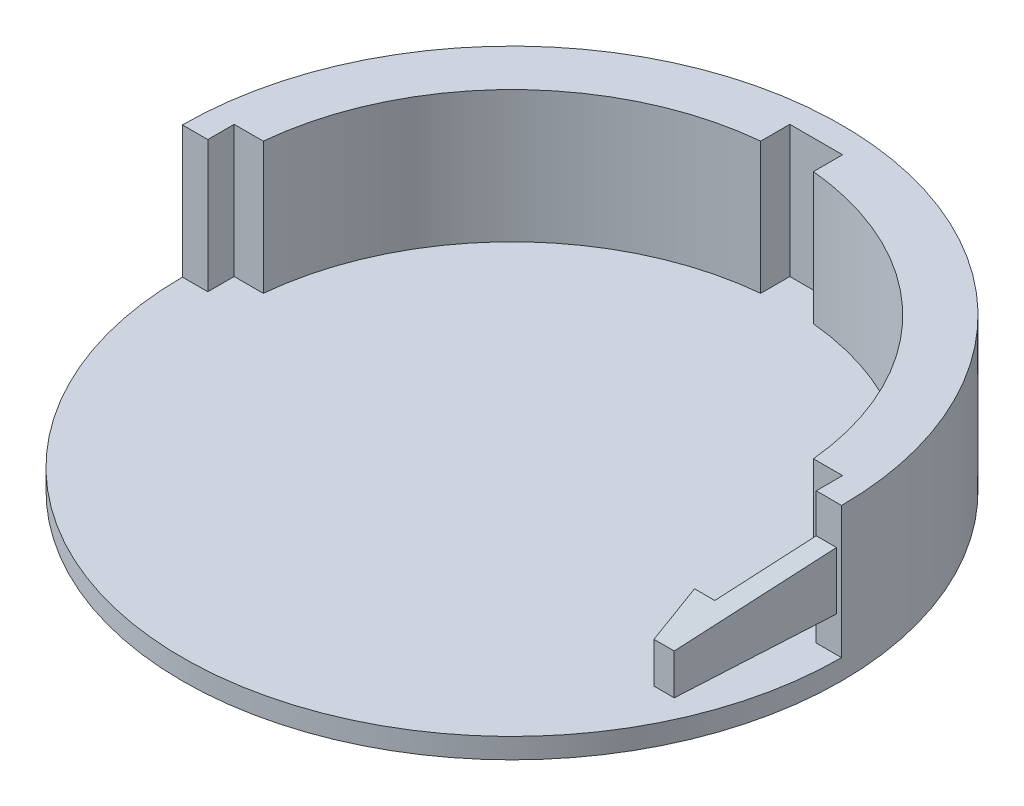
ISO-10303-21;
HEADER;
FILE_DESCRIPTION(('STEP AP214'),'2;1');
FILE_NAME('part.step','',(''),(''),'','','');
FILE_SCHEMA(('AUTOMOTIVE_DESIGN { 1 0 10303 214 1 1 1 1 }'));
ENDSEC;
DATA;
#1=APPLICATION_CONTEXT('core data for automotive mechanical design processes');
#2=APPLICATION_PROTOCOL_DEFINITION('international standard','automotive_design',2000,#1);
#3=PRODUCT_CONTEXT('',#1,'mechanical');
#4=PRODUCT('Part','Part','',(#3));
#5=PRODUCT_RELATED_PRODUCT_CATEGORY('part','',(#4));
#6=PRODUCT_DEFINITION_FORMATION('','',#4);
#7=PRODUCT_DEFINITION_CONTEXT('part definition',#1,'design');
#8=PRODUCT_DEFINITION('design','',#6,#7);
#9=PRODUCT_DEFINITION_SHAPE('','',#8);
#10=(LENGTH_UNIT() NAMED_UNIT(*) SI_UNIT(.MILLI.,.METRE.));
#11=(NAMED_UNIT(*) PLANE_ANGLE_UNIT() SI_UNIT($,.RADIAN.));
#12=(NAMED_UNIT(*) SI_UNIT($,.STERADIAN.) SOLID_ANGLE_UNIT());
#13=UNCERTAINTY_MEASURE_WITH_UNIT(LENGTH_MEASURE(1.E-05),#10,'distance_accuracy_value','');
#14=(GEOMETRIC_REPRESENTATION_CONTEXT(3) GLOBAL_UNCERTAINTY_ASSIGNED_CONTEXT((#13)) GLOBAL_UNIT_ASSIGNED_CONTEXT((#10,
#11,#12)) REPRESENTATION_CONTEXT('',''));
#15=CARTESIAN_POINT('',(0.,0.,0.));
#16=DIRECTION('',(0.,0.,1.));
#17=DIRECTION('',(1.,0.,0.));
#18=AXIS2_PLACEMENT_3D('',#15,#16,#17);
#19=CARTESIAN_POINT('',(0.,2.,0.));
#20=DIRECTION('',(0.,-1.,0.));
#21=DIRECTION('',(0.,0.,-1.));
#22=AXIS2_PLACEMENT_3D('',#19,#20,#21);
#23=CYLINDRICAL_SURFACE('',#22,32.5);
#24=CARTESIAN_POINT('',(0.,15.,0.));
#25=DIRECTION('',(0.,1.,0.));
#26=DIRECTION('',(0.,0.,1.));
#27=AXIS2_PLACEMENT_3D('',#24,#25,#26);
#28=CIRCLE('',#27,32.5);
#29=CARTESIAN_POINT('',(32.5,15.,0.));
#30=VERTEX_POINT('',#29);
#31=CARTESIAN_POINT('',(-32.5,15.,0.));
#32=VERTEX_POINT('',#31);
#33=EDGE_CURVE('E245',#30,#32,#28,.T.);
#34=ORIENTED_EDGE('',*,*,#33,.F.);
#35=DIRECTION('',(0.,-1.,0.));
#36=VECTOR('',#35,1.);
#37=CARTESIAN_POINT('',(32.5,2.,0.));
#38=LINE('',#37,#36);
#39=CARTESIAN_POINT('',(32.5,2.,0.));
#40=VERTEX_POINT('',#39);
#41=EDGE_CURVE('E208',#30,#40,#38,.T.);
#42=ORIENTED_EDGE('',*,*,#41,.T.);
#43=CARTESIAN_POINT('',(0.,2.,0.));
#44=DIRECTION('',(0.,1.,0.));
#45=DIRECTION('',(0.,0.,1.));
#46=AXIS2_PLACEMENT_3D('',#43,#44,#45);
#47=CIRCLE('',#46,32.5);
#48=CARTESIAN_POINT('',(-32.5,2.,0.));
#49=VERTEX_POINT('',#48);
#50=EDGE_CURVE('E212',#49,#40,#47,.T.);
#51=ORIENTED_EDGE('',*,*,#50,.F.);
#52=DIRECTION('',(0.,-1.,0.));
#53=VECTOR('',#52,1.);
#54=CARTESIAN_POINT('',(-32.5,2.,0.));
#55=LINE('',#54,#53);
#56=EDGE_CURVE('E198',#49,#32,#55,.F.);
#57=ORIENTED_EDGE('',*,*,#56,.T.);
#58=EDGE_LOOP('',(#34,#42,#51,#57));
#59=FACE_BOUND('',#58,.T.);
#60=CARTESIAN_POINT('',(0.,0.,0.));
#61=DIRECTION('',(0.,1.,0.));
#62=DIRECTION('',(0.,0.,1.));
#63=AXIS2_PLACEMENT_3D('',#60,#61,#62);
#64=CIRCLE('',#63,32.5);
#65=CARTESIAN_POINT('',(0.,0.,32.5));
#66=VERTEX_POINT('',#65);
#67=EDGE_CURVE('E11',#66,#66,#64,.T.);
#68=ORIENTED_EDGE('',*,*,#67,.T.);
#69=EDGE_LOOP('',(#68));
#70=FACE_BOUND('',#69,.T.);
#71=ADVANCED_FACE('F41',(#59,#70),#23,.T.);
#72=CARTESIAN_POINT('',(0.,0.,0.));
#73=DIRECTION('',(0.,1.,0.));
#74=DIRECTION('',(0.,0.,1.));
#75=AXIS2_PLACEMENT_3D('',#72,#73,#74);
#76=PLANE('',#75);
#77=ORIENTED_EDGE('',*,*,#67,.F.);
#78=EDGE_LOOP('',(#77));
#79=FACE_BOUND('',#78,.T.);
#80=ADVANCED_FACE('F428',(#79),#76,.F.);
#81=CARTESIAN_POINT('',(-30.,15.,0.));
#82=DIRECTION('',(-1.,0.,0.));
#83=DIRECTION('',(0.,0.,1.));
#84=AXIS2_PLACEMENT_3D('',#81,#82,#83);
#85=PLANE('',#84);
#86=DIRECTION('',(0.,0.,-1.));
#87=VECTOR('',#86,1.);
#88=CARTESIAN_POINT('',(-30.,15.,0.));
#89=LINE('',#88,#87);
#90=CARTESIAN_POINT('',(-30.,15.,0.));
#91=VERTEX_POINT('',#90);
#92=CARTESIAN_POINT('',(-30.,15.,-2.60000000000002));
#93=VERTEX_POINT('',#92);
#94=EDGE_CURVE('E223',#91,#93,#89,.T.);
#95=ORIENTED_EDGE('',*,*,#94,.F.);
#96=DIRECTION('',(0.,-1.,0.));
#97=VECTOR('',#96,1.);
#98=CARTESIAN_POINT('',(-30.,15.,0.));
#99=LINE('',#98,#97);
#100=CARTESIAN_POINT('',(-30.,2.,0.));
#101=VERTEX_POINT('',#100);
#102=EDGE_CURVE('E64',#91,#101,#99,.T.);
#103=ORIENTED_EDGE('',*,*,#102,.T.);
#104=DIRECTION('',(0.,0.,-1.));
#105=VECTOR('',#104,1.);
#106=CARTESIAN_POINT('',(-30.,2.,0.));
#107=LINE('',#106,#105);
#108=CARTESIAN_POINT('',(-30.,2.,-2.60000000000002));
#109=VERTEX_POINT('',#108);
#110=EDGE_CURVE('E215',#101,#109,#107,.T.);
#111=ORIENTED_EDGE('',*,*,#110,.T.);
#112=DIRECTION('',(0.,-1.,0.));
#113=VECTOR('',#112,1.);
#114=CARTESIAN_POINT('',(-30.,15.,-2.60000000000002));
#115=LINE('',#114,#113);
#116=EDGE_CURVE('E49',#93,#109,#115,.T.);
#117=ORIENTED_EDGE('',*,*,#116,.F.);
#118=EDGE_LOOP('',(#95,#103,#111,#117));
#119=FACE_BOUND('',#118,.T.);
#120=ADVANCED_FACE('F435',(#119),#85,.F.);
#121=CARTESIAN_POINT('',(0.,15.,-2.60000000000002));
#122=DIRECTION('',(0.,0.,-1.));
#123=DIRECTION('',(-1.,0.,0.));
#124=AXIS2_PLACEMENT_3D('',#121,#122,#123);
#125=PLANE('',#124);
#126=DIRECTION('',(1.,0.,0.));
#127=VECTOR('',#126,1.);
#128=CARTESIAN_POINT('',(0.,2.,-2.60000000000002));
#129=LINE('',#128,#127);
#130=CARTESIAN_POINT('',(-27.1256797149859,2.,-2.60000000000002));
#131=VERTEX_POINT('',#130);
#132=EDGE_CURVE('E259',#109,#131,#129,.T.);
#133=ORIENTED_EDGE('',*,*,#132,.T.);
#134=DIRECTION('',(0.,-1.,0.));
#135=VECTOR('',#134,1.);
#136=CARTESIAN_POINT('',(-27.1256797149859,15.,-2.60000000000002));
#137=LINE('',#136,#135);
#138=CARTESIAN_POINT('',(-27.1256797149859,15.,-2.60000000000002));
#139=VERTEX_POINT('',#138);
#140=EDGE_CURVE('E296',#139,#131,#137,.T.);
#141=ORIENTED_EDGE('',*,*,#140,.F.);
#142=DIRECTION('',(1.,0.,0.));
#143=VECTOR('',#142,1.);
#144=CARTESIAN_POINT('',(0.,15.,-2.60000000000002));
#145=LINE('',#144,#143);
#146=EDGE_CURVE('E226',#93,#139,#145,.T.);
#147=ORIENTED_EDGE('',*,*,#146,.F.);
#148=ORIENTED_EDGE('',*,*,#116,.T.);
#149=EDGE_LOOP('',(#133,#141,#147,#148));
#150=FACE_BOUND('',#149,.T.);
#151=ADVANCED_FACE('F304',(#150),#125,.F.);
#152=CARTESIAN_POINT('',(0.,15.,0.));
#153=DIRECTION('',(0.,-1.,0.));
#154=DIRECTION('',(0.,0.,-1.));
#155=AXIS2_PLACEMENT_3D('',#152,#153,#154);
#156=CYLINDRICAL_SURFACE('',#155,27.25);
#157=CARTESIAN_POINT('',(0.,2.,0.));
#158=DIRECTION('',(0.,1.,0.));
#159=DIRECTION('',(0.,0.,1.));
#160=AXIS2_PLACEMENT_3D('',#157,#158,#159);
#161=CIRCLE('',#160,27.25);
#162=CARTESIAN_POINT('',(-2.59999999999999,2.,-27.1256797149859));
#163=VERTEX_POINT('',#162);
#164=EDGE_CURVE('E256',#163,#131,#161,.T.);
#165=ORIENTED_EDGE('',*,*,#164,.F.);
#166=DIRECTION('',(0.,-1.,0.));
#167=VECTOR('',#166,1.);
#168=CARTESIAN_POINT('',(-2.59999999999999,15.,-27.1256797149859));
#169=LINE('',#168,#167);
#170=CARTESIAN_POINT('',(-2.59999999999999,15.,-27.1256797149859));
#171=VERTEX_POINT('',#170);
#172=EDGE_CURVE('E293',#171,#163,#169,.T.);
#173=ORIENTED_EDGE('',*,*,#172,.F.);
#174=CARTESIAN_POINT('',(0.,15.,0.));
#175=DIRECTION('',(0.,1.,0.));
#176=DIRECTION('',(0.,0.,1.));
#177=AXIS2_PLACEMENT_3D('',#174,#175,#176);
#178=CIRCLE('',#177,27.25);
#179=EDGE_CURVE('E222',#171,#139,#178,.T.);
#180=ORIENTED_EDGE('',*,*,#179,.T.);
#181=ORIENTED_EDGE('',*,*,#140,.T.);
#182=EDGE_LOOP('',(#165,#173,#180,#181));
#183=FACE_BOUND('',#182,.T.);
#184=ADVANCED_FACE('F321',(#183),#156,.F.);
#185=CARTESIAN_POINT('',(-2.59999999999999,15.,0.));
#186=DIRECTION('',(1.,0.,0.));
#187=DIRECTION('',(0.,0.,-1.));
#188=AXIS2_PLACEMENT_3D('',#185,#186,#187);
#189=PLANE('',#188);
#190=DIRECTION('',(0.,0.,1.));
#191=VECTOR('',#190,1.);
#192=CARTESIAN_POINT('',(-2.59999999999999,2.,0.));
#193=LINE('',#192,#191);
#194=CARTESIAN_POINT('',(-2.59999999999999,2.,-30.));
#195=VERTEX_POINT('',#194);
#196=EDGE_CURVE('E263',#195,#163,#193,.T.);
#197=ORIENTED_EDGE('',*,*,#196,.F.);
#198=DIRECTION('',(0.,-1.,0.));
#199=VECTOR('',#198,1.);
#200=CARTESIAN_POINT('',(-2.59999999999999,15.,-30.));
#201=LINE('',#200,#199);
#202=CARTESIAN_POINT('',(-2.59999999999999,15.,-30.));
#203=VERTEX_POINT('',#202);
#204=EDGE_CURVE('E290',#203,#195,#201,.T.);
#205=ORIENTED_EDGE('',*,*,#204,.F.);
#206=DIRECTION('',(0.,0.,1.));
#207=VECTOR('',#206,1.);
#208=CARTESIAN_POINT('',(-2.59999999999999,15.,0.));
#209=LINE('',#208,#207);
#210=EDGE_CURVE('E229',#203,#171,#209,.T.);
#211=ORIENTED_EDGE('',*,*,#210,.T.);
#212=ORIENTED_EDGE('',*,*,#172,.T.);
#213=EDGE_LOOP('',(#197,#205,#211,#212));
#214=FACE_BOUND('',#213,.T.);
#215=ADVANCED_FACE('F327',(#214),#189,.T.);
#216=CARTESIAN_POINT('',(0.,15.,-30.));
#217=DIRECTION('',(0.,0.,-1.));
#218=DIRECTION('',(-1.,0.,0.));
#219=AXIS2_PLACEMENT_3D('',#216,#217,#218);
#220=PLANE('',#219);
#221=DIRECTION('',(1.,0.,0.));
#222=VECTOR('',#221,1.);
#223=CARTESIAN_POINT('',(0.,2.,-30.));
#224=LINE('',#223,#222);
#225=CARTESIAN_POINT('',(2.60000000000001,2.,-30.));
#226=VERTEX_POINT('',#225);
#227=EDGE_CURVE('E267',#195,#226,#224,.T.);
#228=ORIENTED_EDGE('',*,*,#227,.T.);
#229=DIRECTION('',(0.,-1.,0.));
#230=VECTOR('',#229,1.);
#231=CARTESIAN_POINT('',(2.60000000000001,15.,-30.));
#232=LINE('',#231,#230);
#233=CARTESIAN_POINT('',(2.60000000000001,15.,-30.));
#234=VERTEX_POINT('',#233);
#235=EDGE_CURVE('E286',#234,#226,#232,.T.);
#236=ORIENTED_EDGE('',*,*,#235,.F.);
#237=DIRECTION('',(1.,0.,0.));
#238=VECTOR('',#237,1.);
#239=CARTESIAN_POINT('',(0.,15.,-30.));
#240=LINE('',#239,#238);
#241=EDGE_CURVE('E233',#203,#234,#240,.T.);
#242=ORIENTED_EDGE('',*,*,#241,.F.);
#243=ORIENTED_EDGE('',*,*,#204,.T.);
#244=EDGE_LOOP('',(#228,#236,#242,#243));
#245=FACE_BOUND('',#244,.T.);
#246=ADVANCED_FACE('F331',(#245),#220,.F.);
#247=CARTESIAN_POINT('',(2.60000000000001,15.,0.));
#248=DIRECTION('',(1.,0.,0.));
#249=DIRECTION('',(0.,0.,-1.));
#250=AXIS2_PLACEMENT_3D('',#247,#248,#249);
#251=PLANE('',#250);
#252=DIRECTION('',(0.,0.,1.));
#253=VECTOR('',#252,1.);
#254=CARTESIAN_POINT('',(2.60000000000001,2.,0.));
#255=LINE('',#254,#253);
#256=CARTESIAN_POINT('',(2.60000000000001,2.,-27.1256797149859));
#257=VERTEX_POINT('',#256);
#258=EDGE_CURVE('E255',#226,#257,#255,.T.);
#259=ORIENTED_EDGE('',*,*,#258,.T.);
#260=DIRECTION('',(0.,-1.,0.));
#261=VECTOR('',#260,1.);
#262=CARTESIAN_POINT('',(2.60000000000001,15.,-27.1256797149859));
#263=LINE('',#262,#261);
#264=CARTESIAN_POINT('',(2.60000000000001,15.,-27.1256797149859));
#265=VERTEX_POINT('',#264);
#266=EDGE_CURVE('E283',#265,#257,#263,.T.);
#267=ORIENTED_EDGE('',*,*,#266,.F.);
#268=DIRECTION('',(0.,0.,1.));
#269=VECTOR('',#268,1.);
#270=CARTESIAN_POINT('',(2.60000000000001,15.,0.));
#271=LINE('',#270,#269);
#272=EDGE_CURVE('E221',#234,#265,#271,.T.);
#273=ORIENTED_EDGE('',*,*,#272,.F.);
#274=ORIENTED_EDGE('',*,*,#235,.T.);
#275=EDGE_LOOP('',(#259,#267,#273,#274));
#276=FACE_BOUND('',#275,.T.);
#277=ADVANCED_FACE('F337',(#276),#251,.F.);
#278=CARTESIAN_POINT('',(27.1256797149859,2.,-2.60000000000001));
#279=VERTEX_POINT('',#278);
#280=EDGE_CURVE('E250',#279,#257,#161,.T.);
#281=ORIENTED_EDGE('',*,*,#280,.F.);
#282=DIRECTION('',(0.,-1.,0.));
#283=VECTOR('',#282,1.);
#284=CARTESIAN_POINT('',(27.1256797149859,15.,-2.60000000000001));
#285=LINE('',#284,#283);
#286=CARTESIAN_POINT('',(27.1256797149859,15.,-2.60000000000001));
#287=VERTEX_POINT('',#286);
#288=EDGE_CURVE('E280',#287,#279,#285,.T.);
#289=ORIENTED_EDGE('',*,*,#288,.F.);
#290=EDGE_CURVE('E216',#287,#265,#178,.T.);
#291=ORIENTED_EDGE('',*,*,#290,.T.);
#292=ORIENTED_EDGE('',*,*,#266,.T.);
#293=EDGE_LOOP('',(#281,#289,#291,#292));
#294=FACE_BOUND('',#293,.T.);
#295=ADVANCED_FACE('F341',(#294),#156,.F.);
#296=CARTESIAN_POINT('',(0.,15.,-2.6));
#297=DIRECTION('',(0.,0.,1.));
#298=DIRECTION('',(1.,0.,0.));
#299=AXIS2_PLACEMENT_3D('',#296,#297,#298);
#300=PLANE('',#299);
#301=DIRECTION('',(-1.,0.,0.));
#302=VECTOR('',#301,1.);
#303=CARTESIAN_POINT('',(0.,2.,-2.6));
#304=LINE('',#303,#302);
#305=CARTESIAN_POINT('',(30.,2.,-2.60000000000001));
#306=VERTEX_POINT('',#305);
#307=EDGE_CURVE('E254',#306,#279,#304,.T.);
#308=ORIENTED_EDGE('',*,*,#307,.F.);
#309=DIRECTION('',(0.,-1.,0.));
#310=VECTOR('',#309,1.);
#311=CARTESIAN_POINT('',(30.,15.,-2.60000000000001));
#312=LINE('',#311,#310);
#313=CARTESIAN_POINT('',(30.,15.,-2.60000000000001));
#314=VERTEX_POINT('',#313);
#315=EDGE_CURVE('E249',#314,#306,#312,.T.);
#316=ORIENTED_EDGE('',*,*,#315,.F.);
#317=DIRECTION('',(-1.,0.,0.));
#318=VECTOR('',#317,1.);
#319=CARTESIAN_POINT('',(0.,15.,-2.6));
#320=LINE('',#319,#318);
#321=EDGE_CURVE('E220',#314,#287,#320,.T.);
#322=ORIENTED_EDGE('',*,*,#321,.T.);
#323=ORIENTED_EDGE('',*,*,#288,.T.);
#324=EDGE_LOOP('',(#308,#316,#322,#323));
#325=FACE_BOUND('',#324,.T.);
#326=ADVANCED_FACE('F344',(#325),#300,.T.);
#327=CARTESIAN_POINT('',(30.,15.,0.));
#328=DIRECTION('',(1.,0.,0.));
#329=DIRECTION('',(0.,0.,-1.));
#330=AXIS2_PLACEMENT_3D('',#327,#328,#329);
#331=PLANE('',#330);
#332=DIRECTION('',(0.,0.,1.));
#333=VECTOR('',#332,1.);
#334=CARTESIAN_POINT('',(30.,2.,0.));
#335=LINE('',#334,#333);
#336=CARTESIAN_POINT('',(30.,2.,0.));
#337=VERTEX_POINT('',#336);
#338=EDGE_CURVE('E192',#306,#337,#335,.T.);
#339=ORIENTED_EDGE('',*,*,#338,.T.);
#340=DIRECTION('',(0.,1.,0.));
#341=VECTOR('',#340,1.);
#342=CARTESIAN_POINT('',(30.,15.,0.));
#343=LINE('',#342,#341);
#344=CARTESIAN_POINT('',(30.,5.47852393282351,0.));
#345=VERTEX_POINT('',#344);
#346=EDGE_CURVE('E182',#337,#345,#343,.T.);
#347=ORIENTED_EDGE('',*,*,#346,.T.);
#348=DIRECTION('',(0.,-0.0523359562429438,-0.998629534754574));
#349=VECTOR('',#348,1.);
#350=CARTESIAN_POINT('',(30.,6.31704840135217,16.));
#351=LINE('',#350,#349);
#352=CARTESIAN_POINT('',(30.,6.00260172565392,10.));
#353=VERTEX_POINT('',#352);
#354=EDGE_CURVE('E166',#353,#345,#351,.T.);
#355=ORIENTED_EDGE('',*,*,#354,.F.);
#356=DIRECTION('',(0.,-1.,0.));
#357=VECTOR('',#356,1.);
#358=CARTESIAN_POINT('',(30.,8.31704840135217,10.));
#359=LINE('',#358,#357);
#360=CARTESIAN_POINT('',(30.,10.6314950770504,10.));
#361=VERTEX_POINT('',#360);
#362=EDGE_CURVE('E362',#361,#353,#359,.T.);
#363=ORIENTED_EDGE('',*,*,#362,.F.);
#364=DIRECTION('',(0.,-0.0523359562429438,0.998629534754574));
#365=VECTOR('',#364,1.);
#366=CARTESIAN_POINT('',(30.,10.3170484013522,16.));
#367=LINE('',#366,#365);
#368=CARTESIAN_POINT('',(30.,11.1555728698808,0.));
#369=VERTEX_POINT('',#368);
#370=EDGE_CURVE('E56',#369,#361,#367,.T.);
#371=ORIENTED_EDGE('',*,*,#370,.F.);
#372=CARTESIAN_POINT('',(30.,15.,0.));
#373=VERTEX_POINT('',#372);
#374=EDGE_CURVE('E194',#369,#373,#343,.T.);
#375=ORIENTED_EDGE('',*,*,#374,.T.);
#376=DIRECTION('',(0.,0.,1.));
#377=VECTOR('',#376,1.);
#378=CARTESIAN_POINT('',(30.,15.,0.));
#379=LINE('',#378,#377);
#380=EDGE_CURVE('E241',#314,#373,#379,.T.);
#381=ORIENTED_EDGE('',*,*,#380,.F.);
#382=ORIENTED_EDGE('',*,*,#315,.T.);
#383=EDGE_LOOP('',(#339,#347,#355,#363,#371,#375,#381,#382));
#384=FACE_BOUND('',#383,.T.);
#385=ADVANCED_FACE('F190',(#384),#331,.F.);
#386=CARTESIAN_POINT('',(0.,15.,0.));
#387=DIRECTION('',(0.,1.,0.));
#388=DIRECTION('',(0.,0.,1.));
#389=AXIS2_PLACEMENT_3D('',#386,#387,#388);
#390=PLANE('',#389);
#391=DIRECTION('',(-1.,0.,0.));
#392=VECTOR('',#391,1.);
#393=CARTESIAN_POINT('',(35.8547452636856,15.,0.));
#394=LINE('',#393,#392);
#395=EDGE_CURVE('E347',#30,#373,#394,.T.);
#396=ORIENTED_EDGE('',*,*,#395,.F.);
#397=ORIENTED_EDGE('',*,*,#33,.T.);
#398=EDGE_CURVE('E187',#91,#32,#394,.T.);
#399=ORIENTED_EDGE('',*,*,#398,.F.);
#400=ORIENTED_EDGE('',*,*,#94,.T.);
#401=ORIENTED_EDGE('',*,*,#146,.T.);
#402=ORIENTED_EDGE('',*,*,#179,.F.);
#403=ORIENTED_EDGE('',*,*,#210,.F.);
#404=ORIENTED_EDGE('',*,*,#241,.T.);
#405=ORIENTED_EDGE('',*,*,#272,.T.);
#406=ORIENTED_EDGE('',*,*,#290,.F.);
#407=ORIENTED_EDGE('',*,*,#321,.F.);
#408=ORIENTED_EDGE('',*,*,#380,.T.);
#409=EDGE_LOOP('',(#396,#397,#399,#400,#401,#402,#403,#404,#405,#406,#407,#408));
#410=FACE_BOUND('',#409,.T.);
#411=ADVANCED_FACE('F325',(#410),#390,.T.);
#412=CARTESIAN_POINT('',(0.,2.,0.));
#413=DIRECTION('',(0.,1.,0.));
#414=DIRECTION('',(0.,0.,1.));
#415=AXIS2_PLACEMENT_3D('',#412,#413,#414);
#416=PLANE('',#415);
#417=ORIENTED_EDGE('',*,*,#110,.F.);
#418=DIRECTION('',(1.,0.,0.));
#419=VECTOR('',#418,1.);
#420=CARTESIAN_POINT('',(35.8547452636856,2.,0.));
#421=LINE('',#420,#419);
#422=EDGE_CURVE('E200',#49,#101,#421,.T.);
#423=ORIENTED_EDGE('',*,*,#422,.F.);
#424=ORIENTED_EDGE('',*,*,#50,.T.);
#425=EDGE_CURVE('E202',#337,#40,#421,.T.);
#426=ORIENTED_EDGE('',*,*,#425,.F.);
#427=ORIENTED_EDGE('',*,*,#338,.F.);
#428=ORIENTED_EDGE('',*,*,#307,.T.);
#429=ORIENTED_EDGE('',*,*,#280,.T.);
#430=ORIENTED_EDGE('',*,*,#258,.F.);
#431=ORIENTED_EDGE('',*,*,#227,.F.);
#432=ORIENTED_EDGE('',*,*,#196,.T.);
#433=ORIENTED_EDGE('',*,*,#164,.T.);
#434=ORIENTED_EDGE('',*,*,#132,.F.);
#435=EDGE_LOOP('',(#417,#423,#424,#426,#427,#428,#429,#430,#431,#432,#433,#434));
#436=FACE_BOUND('',#435,.T.);
#437=ADVANCED_FACE('F311',(#436),#416,.T.);
#438=CARTESIAN_POINT('',(35.8547452636856,-77.8522708356182,0.));
#439=DIRECTION('',(0.,0.,-1.));
#440=DIRECTION('',(-1.,0.,0.));
#441=AXIS2_PLACEMENT_3D('',#438,#439,#440);
#442=PLANE('',#441);
#443=DIRECTION('',(0.,1.,0.));
#444=VECTOR('',#443,1.);
#445=CARTESIAN_POINT('',(32.,8.31704840135217,0.));
#446=LINE('',#445,#444);
#447=CARTESIAN_POINT('',(32.,5.47852393282351,0.));
#448=VERTEX_POINT('',#447);
#449=CARTESIAN_POINT('',(32.,11.1555728698808,0.));
#450=VERTEX_POINT('',#449);
#451=EDGE_CURVE('E185',#448,#450,#446,.T.);
#452=ORIENTED_EDGE('',*,*,#451,.F.);
#453=DIRECTION('',(1.,0.,0.));
#454=VECTOR('',#453,1.);
#455=CARTESIAN_POINT('',(32.,5.47852393282351,0.));
#456=LINE('',#455,#454);
#457=EDGE_CURVE('E169',#345,#448,#456,.T.);
#458=ORIENTED_EDGE('',*,*,#457,.F.);
#459=ORIENTED_EDGE('',*,*,#346,.F.);
#460=ORIENTED_EDGE('',*,*,#425,.T.);
#461=ORIENTED_EDGE('',*,*,#41,.F.);
#462=ORIENTED_EDGE('',*,*,#395,.T.);
#463=ORIENTED_EDGE('',*,*,#374,.F.);
#464=DIRECTION('',(-1.,0.,0.));
#465=VECTOR('',#464,1.);
#466=CARTESIAN_POINT('',(32.,11.1555728698808,0.));
#467=LINE('',#466,#465);
#468=EDGE_CURVE('E357',#450,#369,#467,.T.);
#469=ORIENTED_EDGE('',*,*,#468,.F.);
#470=EDGE_LOOP('',(#452,#458,#459,#460,#461,#462,#463,#469));
#471=FACE_BOUND('',#470,.T.);
#472=ADVANCED_FACE('F180',(#471),#442,.F.);
#473=ORIENTED_EDGE('',*,*,#422,.T.);
#474=ORIENTED_EDGE('',*,*,#102,.F.);
#475=ORIENTED_EDGE('',*,*,#398,.T.);
#476=ORIENTED_EDGE('',*,*,#56,.F.);
#477=EDGE_LOOP('',(#473,#474,#475,#476));
#478=FACE_BOUND('',#477,.T.);
#479=ADVANCED_FACE('F417',(#478),#442,.F.);
#480=CARTESIAN_POINT('',(30.,8.31704840135217,10.));
#481=DIRECTION('',(0.,0.,-1.));
#482=DIRECTION('',(1.,0.,0.));
#483=AXIS2_PLACEMENT_3D('',#480,#481,#482);
#484=PLANE('',#483);
#485=DIRECTION('',(-1.,0.,0.));
#486=VECTOR('',#485,1.);
#487=CARTESIAN_POINT('',(32.,10.6314950770504,10.));
#488=LINE('',#487,#486);
#489=CARTESIAN_POINT('',(28.,10.6314950770504,10.));
#490=VERTEX_POINT('',#489);
#491=EDGE_CURVE('E356',#361,#490,#488,.T.);
#492=ORIENTED_EDGE('',*,*,#491,.F.);
#493=ORIENTED_EDGE('',*,*,#362,.T.);
#494=DIRECTION('',(-1.,0.,0.));
#495=VECTOR('',#494,1.);
#496=CARTESIAN_POINT('',(30.,6.00260172565392,10.));
#497=LINE('',#496,#495);
#498=CARTESIAN_POINT('',(28.,6.00260172565392,10.));
#499=VERTEX_POINT('',#498);
#500=EDGE_CURVE('E172',#353,#499,#497,.T.);
#501=ORIENTED_EDGE('',*,*,#500,.T.);
#502=DIRECTION('',(0.,1.,0.));
#503=VECTOR('',#502,1.);
#504=CARTESIAN_POINT('',(28.,8.31704840135217,10.));
#505=LINE('',#504,#503);
#506=EDGE_CURVE('E358',#499,#490,#505,.T.);
#507=ORIENTED_EDGE('',*,*,#506,.T.);
#508=EDGE_LOOP('',(#492,#493,#501,#507));
#509=FACE_BOUND('',#508,.T.);
#510=ADVANCED_FACE('F415',(#509),#484,.T.);
#511=CARTESIAN_POINT('',(30.,8.31704840135217,16.));
#512=DIRECTION('',(-0.948683298050514,0.,0.316227766016838));
#513=DIRECTION('',(-0.316227766016838,0.,-0.948683298050514));
#514=AXIS2_PLACEMENT_3D('',#511,#512,#513);
#515=PLANE('',#514);
#516=ORIENTED_EDGE('',*,*,#506,.F.);
#517=DIRECTION('',(-0.315837644607802,-0.0496570487036439,-0.947512933823407));
#518=VECTOR('',#517,1.);
#519=CARTESIAN_POINT('',(30.1995068355028,6.34841553195364,16.5985205065084));
#520=LINE('',#519,#518);
#521=CARTESIAN_POINT('',(30.,6.31704840135217,16.));
#522=VERTEX_POINT('',#521);
#523=EDGE_CURVE('E366',#522,#499,#520,.T.);
#524=ORIENTED_EDGE('',*,*,#523,.F.);
#525=DIRECTION('',(0.,-1.,0.));
#526=VECTOR('',#525,1.);
#527=CARTESIAN_POINT('',(30.,8.31704840135217,16.));
#528=LINE('',#527,#526);
#529=CARTESIAN_POINT('',(30.,10.3170484013522,16.));
#530=VERTEX_POINT('',#529);
#531=EDGE_CURVE('E175',#530,#522,#528,.T.);
#532=ORIENTED_EDGE('',*,*,#531,.F.);
#533=DIRECTION('',(0.315837644607802,-0.0496570487036439,0.947512933823407));
#534=VECTOR('',#533,1.);
#535=CARTESIAN_POINT('',(30.1995068355028,10.2856812707507,16.5985205065084));
#536=LINE('',#535,#534);
#537=EDGE_CURVE('E363',#490,#530,#536,.T.);
#538=ORIENTED_EDGE('',*,*,#537,.F.);
#539=EDGE_LOOP('',(#516,#524,#532,#538));
#540=FACE_BOUND('',#539,.T.);
#541=ADVANCED_FACE('F412',(#540),#515,.T.);
#542=CARTESIAN_POINT('',(32.,8.31704840135217,16.));
#543=DIRECTION('',(0.,0.,1.));
#544=DIRECTION('',(-1.,0.,0.));
#545=AXIS2_PLACEMENT_3D('',#542,#543,#544);
#546=PLANE('',#545);
#547=DIRECTION('',(-1.,0.,0.));
#548=VECTOR('',#547,1.);
#549=CARTESIAN_POINT('',(32.,10.3170484013522,16.));
#550=LINE('',#549,#548);
#551=CARTESIAN_POINT('',(32.,10.3170484013522,16.));
#552=VERTEX_POINT('',#551);
#553=EDGE_CURVE('E176',#552,#530,#550,.T.);
#554=ORIENTED_EDGE('',*,*,#553,.T.);
#555=ORIENTED_EDGE('',*,*,#531,.T.);
#556=DIRECTION('',(-1.,0.,0.));
#557=VECTOR('',#556,1.);
#558=CARTESIAN_POINT('',(32.,6.31704840135217,16.));
#559=LINE('',#558,#557);
#560=CARTESIAN_POINT('',(32.,6.31704840135217,16.));
#561=VERTEX_POINT('',#560);
#562=EDGE_CURVE('E375',#561,#522,#559,.T.);
#563=ORIENTED_EDGE('',*,*,#562,.F.);
#564=DIRECTION('',(0.,1.,0.));
#565=VECTOR('',#564,1.);
#566=CARTESIAN_POINT('',(32.,8.31704840135217,16.));
#567=LINE('',#566,#565);
#568=EDGE_CURVE('E371',#561,#552,#567,.T.);
#569=ORIENTED_EDGE('',*,*,#568,.T.);
#570=EDGE_LOOP('',(#554,#555,#563,#569));
#571=FACE_BOUND('',#570,.T.);
#572=ADVANCED_FACE('F409',(#571),#546,.T.);
#573=CARTESIAN_POINT('',(32.,6.31704840135217,16.));
#574=DIRECTION('',(0.,-0.998629534754574,0.0523359562429438));
#575=DIRECTION('',(0.,0.0523359562429438,0.998629534754574));
#576=AXIS2_PLACEMENT_3D('',#573,#574,#575);
#577=PLANE('',#576);
#578=ORIENTED_EDGE('',*,*,#354,.T.);
#579=ORIENTED_EDGE('',*,*,#457,.T.);
#580=DIRECTION('',(0.,0.0523359562429438,0.998629534754574));
#581=VECTOR('',#580,1.);
#582=CARTESIAN_POINT('',(32.,6.31704840135217,16.));
#583=LINE('',#582,#581);
#584=EDGE_CURVE('E372',#448,#561,#583,.T.);
#585=ORIENTED_EDGE('',*,*,#584,.T.);
#586=ORIENTED_EDGE('',*,*,#562,.T.);
#587=ORIENTED_EDGE('',*,*,#523,.T.);
#588=ORIENTED_EDGE('',*,*,#500,.F.);
#589=EDGE_LOOP('',(#578,#579,#585,#586,#587,#588));
#590=FACE_BOUND('',#589,.T.);
#591=ADVANCED_FACE('F168',(#590),#577,.T.);
#592=CARTESIAN_POINT('',(32.,8.31704840135217,16.));
#593=DIRECTION('',(1.,0.,0.));
#594=DIRECTION('',(0.,1.,0.));
#595=AXIS2_PLACEMENT_3D('',#592,#593,#594);
#596=PLANE('',#595);
#597=ORIENTED_EDGE('',*,*,#584,.F.);
#598=ORIENTED_EDGE('',*,*,#451,.T.);
#599=DIRECTION('',(0.,0.0523359562429438,-0.998629534754574));
#600=VECTOR('',#599,1.);
#601=CARTESIAN_POINT('',(32.,10.3170484013522,16.));
#602=LINE('',#601,#600);
#603=EDGE_CURVE('E367',#552,#450,#602,.T.);
#604=ORIENTED_EDGE('',*,*,#603,.F.);
#605=ORIENTED_EDGE('',*,*,#568,.F.);
#606=EDGE_LOOP('',(#597,#598,#604,#605));
#607=FACE_BOUND('',#606,.T.);
#608=ADVANCED_FACE('F401',(#607),#596,.T.);
#609=CARTESIAN_POINT('',(32.,10.3170484013522,16.));
#610=DIRECTION('',(0.,0.998629534754574,0.0523359562429438));
#611=DIRECTION('',(0.,0.0523359562429438,-0.998629534754574));
#612=AXIS2_PLACEMENT_3D('',#609,#610,#611);
#613=PLANE('',#612);
#614=ORIENTED_EDGE('',*,*,#603,.T.);
#615=ORIENTED_EDGE('',*,*,#468,.T.);
#616=ORIENTED_EDGE('',*,*,#370,.T.);
#617=ORIENTED_EDGE('',*,*,#491,.T.);
#618=ORIENTED_EDGE('',*,*,#537,.T.);
#619=ORIENTED_EDGE('',*,*,#553,.F.);
#620=EDGE_LOOP('',(#614,#615,#616,#617,#618,#619));
#621=FACE_BOUND('',#620,.T.);
#622=ADVANCED_FACE('F404',(#621),#613,.T.);
#623=CLOSED_SHELL('',(#71,#80,#120,#151,#184,#215,#246,#277,#295,#326,#385,#411,#437,#472,#479,
#510,#541,#572,#591,#608,#622));
#624=MANIFOLD_SOLID_BREP('B2',#623);
#625=ADVANCED_BREP_SHAPE_REPRESENTATION('',(#18,#624),#14);
#626=SHAPE_DEFINITION_REPRESENTATION(#9,#625);
ENDSEC;
END-ISO-10303-21;
